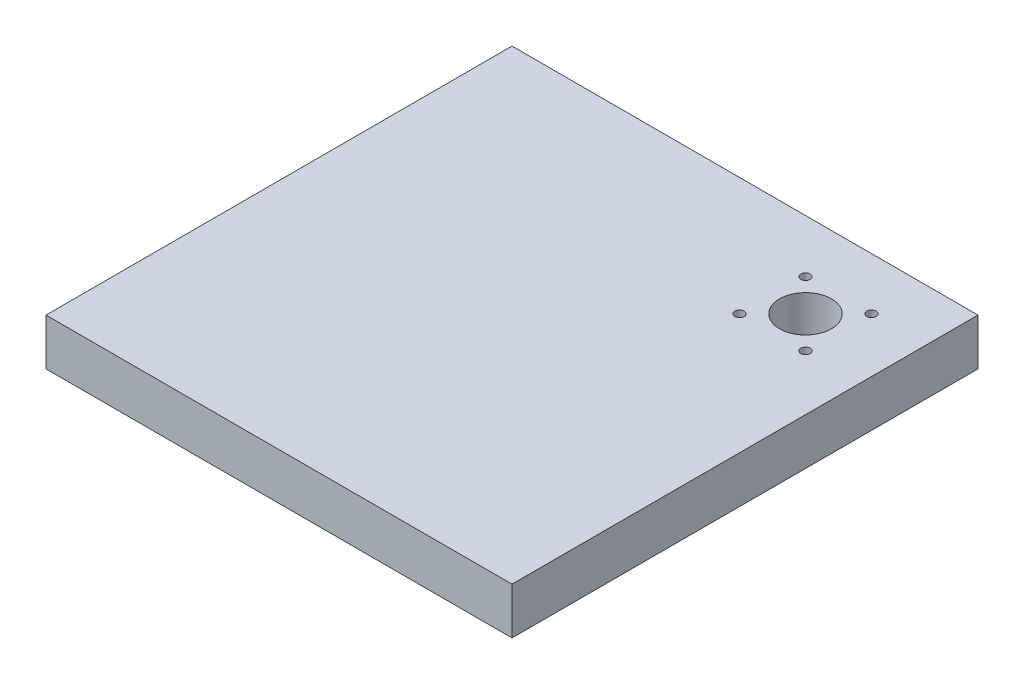
ISO-10303-21;
HEADER;
FILE_DESCRIPTION(('STEP AP214'),'2;1');
FILE_NAME('part.step','',(''),(''),'','','');
FILE_SCHEMA(('AUTOMOTIVE_DESIGN { 1 0 10303 214 1 1 1 1 }'));
ENDSEC;
DATA;
#1=APPLICATION_CONTEXT('core data for automotive mechanical design processes');
#2=APPLICATION_PROTOCOL_DEFINITION('international standard','automotive_design',2000,#1);
#3=PRODUCT_CONTEXT('',#1,'mechanical');
#4=PRODUCT('Part','Part','',(#3));
#5=PRODUCT_RELATED_PRODUCT_CATEGORY('part','',(#4));
#6=PRODUCT_DEFINITION_FORMATION('','',#4);
#7=PRODUCT_DEFINITION_CONTEXT('part definition',#1,'design');
#8=PRODUCT_DEFINITION('design','',#6,#7);
#9=PRODUCT_DEFINITION_SHAPE('','',#8);
#10=(LENGTH_UNIT() NAMED_UNIT(*) SI_UNIT(.MILLI.,.METRE.));
#11=(NAMED_UNIT(*) PLANE_ANGLE_UNIT() SI_UNIT($,.RADIAN.));
#12=(NAMED_UNIT(*) SI_UNIT($,.STERADIAN.) SOLID_ANGLE_UNIT());
#13=UNCERTAINTY_MEASURE_WITH_UNIT(LENGTH_MEASURE(1.E-05),#10,'distance_accuracy_value','');
#14=(GEOMETRIC_REPRESENTATION_CONTEXT(3) GLOBAL_UNCERTAINTY_ASSIGNED_CONTEXT((#13)) GLOBAL_UNIT_ASSIGNED_CONTEXT((#10,
#11,#12)) REPRESENTATION_CONTEXT('',''));
#15=CARTESIAN_POINT('',(0.,0.,0.));
#16=DIRECTION('',(0.,0.,1.));
#17=DIRECTION('',(1.,0.,0.));
#18=AXIS2_PLACEMENT_3D('',#15,#16,#17);
#19=CARTESIAN_POINT('',(0.,0.,0.));
#20=DIRECTION('',(0.,1.,0.));
#21=DIRECTION('',(0.,0.,1.));
#22=AXIS2_PLACEMENT_3D('',#19,#20,#21);
#23=PLANE('',#22);
#24=CARTESIAN_POINT('',(79.3749999999999,0.,-80.6));
#25=DIRECTION('',(0.,-1.,0.));
#26=DIRECTION('',(0.,0.,-1.));
#27=AXIS2_PLACEMENT_3D('',#24,#25,#26);
#28=CIRCLE('',#27,14.1605);
#29=CARTESIAN_POINT('',(79.3749999999999,0.,-94.7605));
#30=VERTEX_POINT('',#29);
#31=EDGE_CURVE('E163',#30,#30,#28,.T.);
#32=ORIENTED_EDGE('',*,*,#31,.F.);
#33=EDGE_LOOP('',(#32));
#34=FACE_BOUND('',#33,.T.);
#35=CARTESIAN_POINT('',(97.3355122421383,0.,-98.5605122421383));
#36=DIRECTION('',(0.,-1.,0.));
#37=DIRECTION('',(0.,0.,-1.));
#38=AXIS2_PLACEMENT_3D('',#35,#36,#37);
#39=CIRCLE('',#38,2.55269999999999);
#40=CARTESIAN_POINT('',(97.3355122421383,0.,-101.113212242138));
#41=VERTEX_POINT('',#40);
#42=EDGE_CURVE('E147',#41,#41,#39,.T.);
#43=ORIENTED_EDGE('',*,*,#42,.F.);
#44=EDGE_LOOP('',(#43));
#45=FACE_BOUND('',#44,.T.);
#46=DIRECTION('',(0.,0.,-1.));
#47=VECTOR('',#46,1.);
#48=CARTESIAN_POINT('',(127.,0.,-127.));
#49=LINE('',#48,#47);
#50=CARTESIAN_POINT('',(127.,0.,127.));
#51=VERTEX_POINT('',#50);
#52=CARTESIAN_POINT('',(127.,0.,-127.));
#53=VERTEX_POINT('',#52);
#54=EDGE_CURVE('E107',#51,#53,#49,.T.);
#55=ORIENTED_EDGE('',*,*,#54,.F.);
#56=DIRECTION('',(1.,0.,0.));
#57=VECTOR('',#56,1.);
#58=CARTESIAN_POINT('',(-127.,0.,127.));
#59=LINE('',#58,#57);
#60=CARTESIAN_POINT('',(-127.,0.,127.));
#61=VERTEX_POINT('',#60);
#62=EDGE_CURVE('E79',#61,#51,#59,.T.);
#63=ORIENTED_EDGE('',*,*,#62,.F.);
#64=DIRECTION('',(0.,0.,1.));
#65=VECTOR('',#64,1.);
#66=CARTESIAN_POINT('',(-127.,0.,-127.));
#67=LINE('',#66,#65);
#68=CARTESIAN_POINT('',(-127.,0.,-127.));
#69=VERTEX_POINT('',#68);
#70=EDGE_CURVE('E73',#69,#61,#67,.T.);
#71=ORIENTED_EDGE('',*,*,#70,.F.);
#72=DIRECTION('',(-1.,0.,0.));
#73=VECTOR('',#72,1.);
#74=CARTESIAN_POINT('',(-127.,0.,-127.));
#75=LINE('',#74,#73);
#76=EDGE_CURVE('E96',#53,#69,#75,.T.);
#77=ORIENTED_EDGE('',*,*,#76,.F.);
#78=EDGE_LOOP('',(#55,#63,#71,#77));
#79=FACE_BOUND('',#78,.T.);
#80=CARTESIAN_POINT('',(96.8749999999999,0.,-63.1));
#81=DIRECTION('',(0.,-1.,0.));
#82=DIRECTION('',(0.,0.,-1.));
#83=AXIS2_PLACEMENT_3D('',#80,#81,#82);
#84=CIRCLE('',#83,2.55269999999999);
#85=CARTESIAN_POINT('',(96.8749999999999,0.,-65.6527));
#86=VERTEX_POINT('',#85);
#87=EDGE_CURVE('E131',#86,#86,#84,.T.);
#88=ORIENTED_EDGE('',*,*,#87,.F.);
#89=EDGE_LOOP('',(#88));
#90=FACE_BOUND('',#89,.T.);
#91=CARTESIAN_POINT('',(61.8749999999999,0.,-98.1));
#92=DIRECTION('',(0.,-1.,0.));
#93=DIRECTION('',(0.,0.,-1.));
#94=AXIS2_PLACEMENT_3D('',#91,#92,#93);
#95=CIRCLE('',#94,2.55269999999999);
#96=CARTESIAN_POINT('',(61.8749999999999,0.,-100.6527));
#97=VERTEX_POINT('',#96);
#98=EDGE_CURVE('E139',#97,#97,#95,.T.);
#99=ORIENTED_EDGE('',*,*,#98,.F.);
#100=EDGE_LOOP('',(#99));
#101=FACE_BOUND('',#100,.T.);
#102=CARTESIAN_POINT('',(61.4144877578616,0.,-62.6394877578617));
#103=DIRECTION('',(0.,-1.,0.));
#104=DIRECTION('',(0.,0.,-1.));
#105=AXIS2_PLACEMENT_3D('',#102,#103,#104);
#106=CIRCLE('',#105,2.55269999999999);
#107=CARTESIAN_POINT('',(61.4144877578616,0.,-65.1921877578617));
#108=VERTEX_POINT('',#107);
#109=EDGE_CURVE('E155',#108,#108,#106,.T.);
#110=ORIENTED_EDGE('',*,*,#109,.F.);
#111=EDGE_LOOP('',(#110));
#112=FACE_BOUND('',#111,.T.);
#113=ADVANCED_FACE('F38',(#34,#45,#79,#90,#101,#112),#23,.F.);
#114=CARTESIAN_POINT('',(127.,25.4,-127.));
#115=DIRECTION('',(-1.,0.,0.));
#116=DIRECTION('',(0.,0.,1.));
#117=AXIS2_PLACEMENT_3D('',#114,#115,#116);
#118=PLANE('',#117);
#119=ORIENTED_EDGE('',*,*,#54,.T.);
#120=DIRECTION('',(0.,-1.,0.));
#121=VECTOR('',#120,1.);
#122=CARTESIAN_POINT('',(127.,25.4,-127.));
#123=LINE('',#122,#121);
#124=CARTESIAN_POINT('',(127.,25.4,-127.));
#125=VERTEX_POINT('',#124);
#126=EDGE_CURVE('E11',#125,#53,#123,.T.);
#127=ORIENTED_EDGE('',*,*,#126,.F.);
#128=DIRECTION('',(0.,0.,-1.));
#129=VECTOR('',#128,1.);
#130=CARTESIAN_POINT('',(127.,25.4,-127.));
#131=LINE('',#130,#129);
#132=CARTESIAN_POINT('',(127.,25.4,127.));
#133=VERTEX_POINT('',#132);
#134=EDGE_CURVE('E91',#133,#125,#131,.T.);
#135=ORIENTED_EDGE('',*,*,#134,.F.);
#136=DIRECTION('',(0.,-1.,0.));
#137=VECTOR('',#136,1.);
#138=CARTESIAN_POINT('',(127.,25.4,127.));
#139=LINE('',#138,#137);
#140=EDGE_CURVE('E103',#133,#51,#139,.T.);
#141=ORIENTED_EDGE('',*,*,#140,.T.);
#142=EDGE_LOOP('',(#119,#127,#135,#141));
#143=FACE_BOUND('',#142,.T.);
#144=ADVANCED_FACE('F40',(#143),#118,.F.);
#145=CARTESIAN_POINT('',(-127.,25.4,-127.));
#146=DIRECTION('',(0.,0.,1.));
#147=DIRECTION('',(1.,0.,0.));
#148=AXIS2_PLACEMENT_3D('',#145,#146,#147);
#149=PLANE('',#148);
#150=ORIENTED_EDGE('',*,*,#76,.T.);
#151=DIRECTION('',(0.,-1.,0.));
#152=VECTOR('',#151,1.);
#153=CARTESIAN_POINT('',(-127.,25.4,-127.));
#154=LINE('',#153,#152);
#155=CARTESIAN_POINT('',(-127.,25.4,-127.));
#156=VERTEX_POINT('',#155);
#157=EDGE_CURVE('E48',#156,#69,#154,.T.);
#158=ORIENTED_EDGE('',*,*,#157,.F.);
#159=DIRECTION('',(-1.,0.,0.));
#160=VECTOR('',#159,1.);
#161=CARTESIAN_POINT('',(-127.,25.4,-127.));
#162=LINE('',#161,#160);
#163=EDGE_CURVE('E86',#125,#156,#162,.T.);
#164=ORIENTED_EDGE('',*,*,#163,.F.);
#165=ORIENTED_EDGE('',*,*,#126,.T.);
#166=EDGE_LOOP('',(#150,#158,#164,#165));
#167=FACE_BOUND('',#166,.T.);
#168=ADVANCED_FACE('F95',(#167),#149,.F.);
#169=CARTESIAN_POINT('',(-127.,25.4,-127.));
#170=DIRECTION('',(1.,0.,0.));
#171=DIRECTION('',(0.,0.,-1.));
#172=AXIS2_PLACEMENT_3D('',#169,#170,#171);
#173=PLANE('',#172);
#174=ORIENTED_EDGE('',*,*,#70,.T.);
#175=DIRECTION('',(0.,-1.,0.));
#176=VECTOR('',#175,1.);
#177=CARTESIAN_POINT('',(-127.,25.4,127.));
#178=LINE('',#177,#176);
#179=CARTESIAN_POINT('',(-127.,25.4,127.));
#180=VERTEX_POINT('',#179);
#181=EDGE_CURVE('E98',#180,#61,#178,.T.);
#182=ORIENTED_EDGE('',*,*,#181,.F.);
#183=DIRECTION('',(0.,0.,1.));
#184=VECTOR('',#183,1.);
#185=CARTESIAN_POINT('',(-127.,25.4,-127.));
#186=LINE('',#185,#184);
#187=EDGE_CURVE('E89',#156,#180,#186,.T.);
#188=ORIENTED_EDGE('',*,*,#187,.F.);
#189=ORIENTED_EDGE('',*,*,#157,.T.);
#190=EDGE_LOOP('',(#174,#182,#188,#189));
#191=FACE_BOUND('',#190,.T.);
#192=ADVANCED_FACE('F99',(#191),#173,.F.);
#193=CARTESIAN_POINT('',(-127.,25.4,127.));
#194=DIRECTION('',(0.,0.,-1.));
#195=DIRECTION('',(-1.,0.,0.));
#196=AXIS2_PLACEMENT_3D('',#193,#194,#195);
#197=PLANE('',#196);
#198=ORIENTED_EDGE('',*,*,#62,.T.);
#199=ORIENTED_EDGE('',*,*,#140,.F.);
#200=DIRECTION('',(1.,0.,0.));
#201=VECTOR('',#200,1.);
#202=CARTESIAN_POINT('',(-127.,25.4,127.));
#203=LINE('',#202,#201);
#204=EDGE_CURVE('E56',#180,#133,#203,.T.);
#205=ORIENTED_EDGE('',*,*,#204,.F.);
#206=ORIENTED_EDGE('',*,*,#181,.T.);
#207=EDGE_LOOP('',(#198,#199,#205,#206));
#208=FACE_BOUND('',#207,.T.);
#209=ADVANCED_FACE('F121',(#208),#197,.F.);
#210=CARTESIAN_POINT('',(0.,25.4,0.));
#211=DIRECTION('',(0.,1.,0.));
#212=DIRECTION('',(0.,0.,1.));
#213=AXIS2_PLACEMENT_3D('',#210,#211,#212);
#214=PLANE('',#213);
#215=CARTESIAN_POINT('',(79.3749999999999,25.4,-80.6));
#216=DIRECTION('',(0.,-1.,0.));
#217=DIRECTION('',(0.,0.,-1.));
#218=AXIS2_PLACEMENT_3D('',#215,#216,#217);
#219=CIRCLE('',#218,14.1605);
#220=CARTESIAN_POINT('',(79.3749999999999,25.4,-94.7605));
#221=VERTEX_POINT('',#220);
#222=EDGE_CURVE('E159',#221,#221,#219,.T.);
#223=ORIENTED_EDGE('',*,*,#222,.T.);
#224=EDGE_LOOP('',(#223));
#225=FACE_BOUND('',#224,.T.);
#226=CARTESIAN_POINT('',(61.4144877578616,25.4,-62.6394877578617));
#227=DIRECTION('',(0.,1.,0.));
#228=DIRECTION('',(0.,0.,1.));
#229=AXIS2_PLACEMENT_3D('',#226,#227,#228);
#230=CIRCLE('',#229,2.55269999999999);
#231=CARTESIAN_POINT('',(61.4144877578616,25.4,-60.0867877578617));
#232=VERTEX_POINT('',#231);
#233=EDGE_CURVE('E151',#232,#232,#230,.T.);
#234=ORIENTED_EDGE('',*,*,#233,.F.);
#235=EDGE_LOOP('',(#234));
#236=FACE_BOUND('',#235,.T.);
#237=CARTESIAN_POINT('',(97.3355122421383,25.4,-98.5605122421383));
#238=DIRECTION('',(0.,1.,0.));
#239=DIRECTION('',(0.,0.,1.));
#240=AXIS2_PLACEMENT_3D('',#237,#238,#239);
#241=CIRCLE('',#240,2.55269999999999);
#242=CARTESIAN_POINT('',(97.3355122421383,25.4,-96.0078122421383));
#243=VERTEX_POINT('',#242);
#244=EDGE_CURVE('E143',#243,#243,#241,.T.);
#245=ORIENTED_EDGE('',*,*,#244,.F.);
#246=EDGE_LOOP('',(#245));
#247=FACE_BOUND('',#246,.T.);
#248=CARTESIAN_POINT('',(61.8749999999999,25.4,-98.1));
#249=DIRECTION('',(0.,1.,0.));
#250=DIRECTION('',(0.,0.,1.));
#251=AXIS2_PLACEMENT_3D('',#248,#249,#250);
#252=CIRCLE('',#251,2.55269999999999);
#253=CARTESIAN_POINT('',(61.8749999999999,25.4,-95.5473));
#254=VERTEX_POINT('',#253);
#255=EDGE_CURVE('E135',#254,#254,#252,.T.);
#256=ORIENTED_EDGE('',*,*,#255,.F.);
#257=EDGE_LOOP('',(#256));
#258=FACE_BOUND('',#257,.T.);
#259=CARTESIAN_POINT('',(96.8749999999999,25.4,-63.1));
#260=DIRECTION('',(0.,1.,0.));
#261=DIRECTION('',(0.,0.,1.));
#262=AXIS2_PLACEMENT_3D('',#259,#260,#261);
#263=CIRCLE('',#262,2.55269999999999);
#264=CARTESIAN_POINT('',(96.8749999999999,25.4,-60.5473));
#265=VERTEX_POINT('',#264);
#266=EDGE_CURVE('E111',#265,#265,#263,.T.);
#267=ORIENTED_EDGE('',*,*,#266,.F.);
#268=EDGE_LOOP('',(#267));
#269=FACE_BOUND('',#268,.T.);
#270=ORIENTED_EDGE('',*,*,#134,.T.);
#271=ORIENTED_EDGE('',*,*,#163,.T.);
#272=ORIENTED_EDGE('',*,*,#187,.T.);
#273=ORIENTED_EDGE('',*,*,#204,.T.);
#274=EDGE_LOOP('',(#270,#271,#272,#273));
#275=FACE_BOUND('',#274,.T.);
#276=ADVANCED_FACE('F87',(#225,#236,#247,#258,#269,#275),#214,.T.);
#277=CARTESIAN_POINT('',(96.8749999999999,0.,-63.1));
#278=DIRECTION('',(0.,-1.,0.));
#279=DIRECTION('',(0.,0.,-1.));
#280=AXIS2_PLACEMENT_3D('',#277,#278,#279);
#281=CYLINDRICAL_SURFACE('',#280,2.55269999999999);
#282=ORIENTED_EDGE('',*,*,#87,.T.);
#283=EDGE_LOOP('',(#282));
#284=FACE_BOUND('',#283,.T.);
#285=ORIENTED_EDGE('',*,*,#266,.T.);
#286=EDGE_LOOP('',(#285));
#287=FACE_BOUND('',#286,.T.);
#288=ADVANCED_FACE('F185',(#284,#287),#281,.F.);
#289=CARTESIAN_POINT('',(61.8749999999999,0.,-98.1));
#290=DIRECTION('',(0.,-1.,0.));
#291=DIRECTION('',(0.,0.,-1.));
#292=AXIS2_PLACEMENT_3D('',#289,#290,#291);
#293=CYLINDRICAL_SURFACE('',#292,2.55269999999999);
#294=ORIENTED_EDGE('',*,*,#98,.T.);
#295=EDGE_LOOP('',(#294));
#296=FACE_BOUND('',#295,.T.);
#297=ORIENTED_EDGE('',*,*,#255,.T.);
#298=EDGE_LOOP('',(#297));
#299=FACE_BOUND('',#298,.T.);
#300=ADVANCED_FACE('F179',(#296,#299),#293,.F.);
#301=CARTESIAN_POINT('',(97.3355122421383,0.,-98.5605122421383));
#302=DIRECTION('',(0.,-1.,0.));
#303=DIRECTION('',(0.,0.,-1.));
#304=AXIS2_PLACEMENT_3D('',#301,#302,#303);
#305=CYLINDRICAL_SURFACE('',#304,2.55269999999999);
#306=ORIENTED_EDGE('',*,*,#42,.T.);
#307=EDGE_LOOP('',(#306));
#308=FACE_BOUND('',#307,.T.);
#309=ORIENTED_EDGE('',*,*,#244,.T.);
#310=EDGE_LOOP('',(#309));
#311=FACE_BOUND('',#310,.T.);
#312=ADVANCED_FACE('F175',(#308,#311),#305,.F.);
#313=CARTESIAN_POINT('',(61.4144877578616,0.,-62.6394877578617));
#314=DIRECTION('',(0.,-1.,0.));
#315=DIRECTION('',(0.,0.,-1.));
#316=AXIS2_PLACEMENT_3D('',#313,#314,#315);
#317=CYLINDRICAL_SURFACE('',#316,2.55269999999999);
#318=ORIENTED_EDGE('',*,*,#109,.T.);
#319=EDGE_LOOP('',(#318));
#320=FACE_BOUND('',#319,.T.);
#321=ORIENTED_EDGE('',*,*,#233,.T.);
#322=EDGE_LOOP('',(#321));
#323=FACE_BOUND('',#322,.T.);
#324=ADVANCED_FACE('F178',(#320,#323),#317,.F.);
#325=CARTESIAN_POINT('',(79.3749999999999,0.,-80.6));
#326=DIRECTION('',(0.,-1.,0.));
#327=DIRECTION('',(0.,0.,-1.));
#328=AXIS2_PLACEMENT_3D('',#325,#326,#327);
#329=CYLINDRICAL_SURFACE('',#328,14.1605);
#330=ORIENTED_EDGE('',*,*,#222,.F.);
#331=EDGE_LOOP('',(#330));
#332=FACE_BOUND('',#331,.T.);
#333=ORIENTED_EDGE('',*,*,#31,.T.);
#334=EDGE_LOOP('',(#333));
#335=FACE_BOUND('',#334,.T.);
#336=ADVANCED_FACE('F168',(#332,#335),#329,.F.);
#337=CLOSED_SHELL('',(#113,#144,#168,#192,#209,#276,#288,#300,#312,#324,#336));
#338=MANIFOLD_SOLID_BREP('B2',#337);
#339=ADVANCED_BREP_SHAPE_REPRESENTATION('',(#18,#338),#14);
#340=SHAPE_DEFINITION_REPRESENTATION(#9,#339);
ENDSEC;
END-ISO-10303-21;
